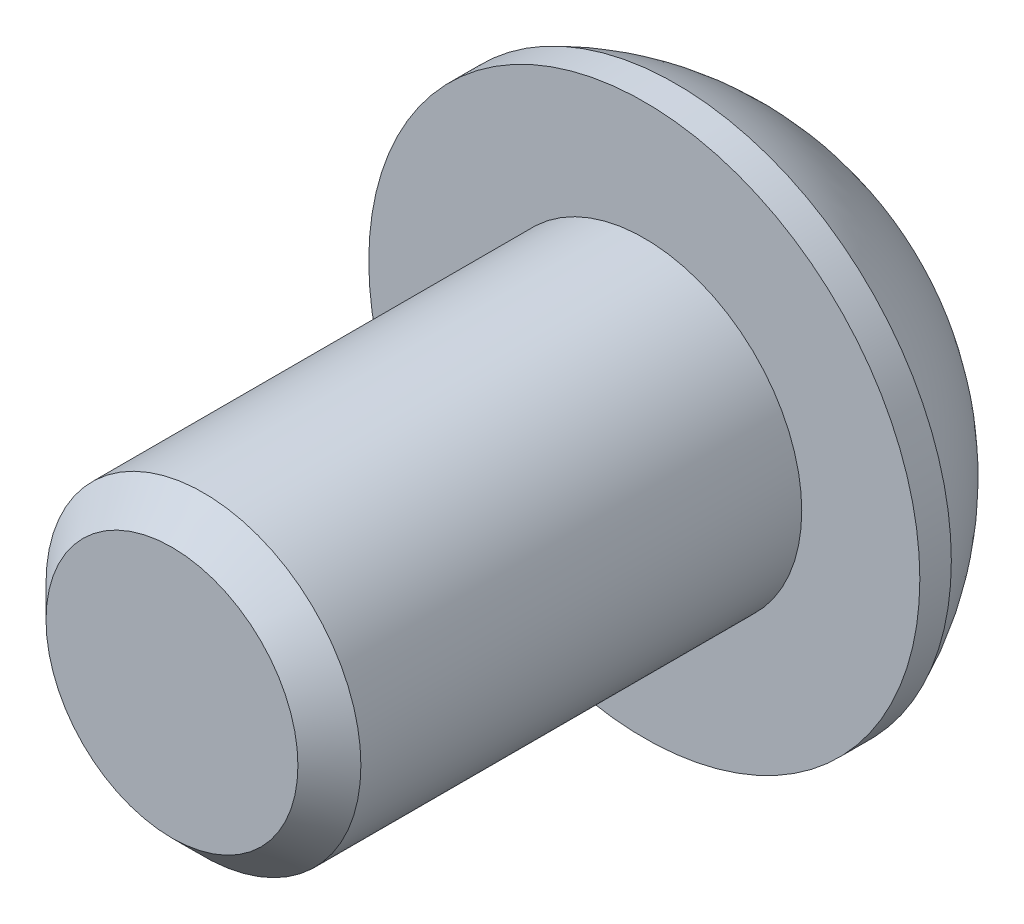
ISO-10303-21;
HEADER;
FILE_DESCRIPTION(('STEP AP214'),'2;1');
FILE_NAME('part.step','',(''),(''),'','','');
FILE_SCHEMA(('AUTOMOTIVE_DESIGN { 1 0 10303 214 1 1 1 1 }'));
ENDSEC;
DATA;
#1=APPLICATION_CONTEXT('core data for automotive mechanical design processes');
#2=APPLICATION_PROTOCOL_DEFINITION('international standard','automotive_design',2000,#1);
#3=PRODUCT_CONTEXT('',#1,'mechanical');
#4=PRODUCT('Part','Part','',(#3));
#5=PRODUCT_RELATED_PRODUCT_CATEGORY('part','',(#4));
#6=PRODUCT_DEFINITION_FORMATION('','',#4);
#7=PRODUCT_DEFINITION_CONTEXT('part definition',#1,'design');
#8=PRODUCT_DEFINITION('design','',#6,#7);
#9=PRODUCT_DEFINITION_SHAPE('','',#8);
#10=(LENGTH_UNIT() NAMED_UNIT(*) SI_UNIT(.MILLI.,.METRE.));
#11=(NAMED_UNIT(*) PLANE_ANGLE_UNIT() SI_UNIT($,.RADIAN.));
#12=(NAMED_UNIT(*) SI_UNIT($,.STERADIAN.) SOLID_ANGLE_UNIT());
#13=UNCERTAINTY_MEASURE_WITH_UNIT(LENGTH_MEASURE(1.E-05),#10,'distance_accuracy_value','');
#14=(GEOMETRIC_REPRESENTATION_CONTEXT(3) GLOBAL_UNCERTAINTY_ASSIGNED_CONTEXT((#13)) GLOBAL_UNIT_ASSIGNED_CONTEXT((#10,
#11,#12)) REPRESENTATION_CONTEXT('',''));
#15=CARTESIAN_POINT('',(0.,0.,0.));
#16=DIRECTION('',(0.,0.,1.));
#17=DIRECTION('',(1.,0.,0.));
#18=AXIS2_PLACEMENT_3D('',#15,#16,#17);
#19=CARTESIAN_POINT('',(0.,0.,-2.1));
#20=DIRECTION('',(0.,0.,1.));
#21=DIRECTION('',(1.,0.,0.));
#22=AXIS2_PLACEMENT_3D('',#19,#20,#21);
#23=PLANE('',#22);
#24=DIRECTION('',(0.866025403784439,0.499999999999999,0.));
#25=VECTOR('',#24,1.);
#26=CARTESIAN_POINT('',(2.5,-1.44337567297406,-2.1));
#27=LINE('',#26,#25);
#28=CARTESIAN_POINT('',(2.5,-1.44337567297406,-2.1));
#29=VERTEX_POINT('',#28);
#30=CARTESIAN_POINT('',(0.,-2.88675134594813,-2.1));
#31=VERTEX_POINT('',#30);
#32=EDGE_CURVE('E73',#29,#31,#27,.F.);
#33=ORIENTED_EDGE('',*,*,#32,.T.);
#34=DIRECTION('',(0.866025403784438,-0.5,0.));
#35=VECTOR('',#34,1.);
#36=CARTESIAN_POINT('',(0.,-2.88675134594813,-2.1));
#37=LINE('',#36,#35);
#38=CARTESIAN_POINT('',(-2.5,-1.44337567297406,-2.1));
#39=VERTEX_POINT('',#38);
#40=EDGE_CURVE('E145',#31,#39,#37,.F.);
#41=ORIENTED_EDGE('',*,*,#40,.T.);
#42=DIRECTION('',(0.,1.,0.));
#43=VECTOR('',#42,1.);
#44=CARTESIAN_POINT('',(-2.5,-1.44337567297406,-2.1));
#45=LINE('',#44,#43);
#46=CARTESIAN_POINT('',(-2.5,1.44337567297407,-2.1));
#47=VERTEX_POINT('',#46);
#48=EDGE_CURVE('E153',#39,#47,#45,.T.);
#49=ORIENTED_EDGE('',*,*,#48,.T.);
#50=DIRECTION('',(-0.866025403784439,-0.5,0.));
#51=VECTOR('',#50,1.);
#52=CARTESIAN_POINT('',(-2.5,1.44337567297407,-2.1));
#53=LINE('',#52,#51);
#54=CARTESIAN_POINT('',(0.,2.88675134594813,-2.1));
#55=VERTEX_POINT('',#54);
#56=EDGE_CURVE('E158',#47,#55,#53,.F.);
#57=ORIENTED_EDGE('',*,*,#56,.T.);
#58=DIRECTION('',(-0.866025403784439,0.5,0.));
#59=VECTOR('',#58,1.);
#60=CARTESIAN_POINT('',(0.,2.88675134594813,-2.1));
#61=LINE('',#60,#59);
#62=CARTESIAN_POINT('',(2.5,1.44337567297406,-2.1));
#63=VERTEX_POINT('',#62);
#64=EDGE_CURVE('E69',#55,#63,#61,.F.);
#65=ORIENTED_EDGE('',*,*,#64,.T.);
#66=DIRECTION('',(0.,1.,0.));
#67=VECTOR('',#66,1.);
#68=CARTESIAN_POINT('',(2.5,1.44337567297406,-2.1));
#69=LINE('',#68,#67);
#70=EDGE_CURVE('E71',#63,#29,#69,.F.);
#71=ORIENTED_EDGE('',*,*,#70,.T.);
#72=EDGE_LOOP('',(#33,#41,#49,#57,#65,#71));
#73=FACE_BOUND('',#72,.T.);
#74=ADVANCED_FACE('F17',(#73),#23,.F.);
#75=CARTESIAN_POINT('',(2.5,-1.44337567297406,-4.4));
#76=DIRECTION('',(0.499999999999999,-0.866025403784439,0.));
#77=DIRECTION('',(0.866025403784439,0.499999999999999,0.));
#78=AXIS2_PLACEMENT_3D('',#75,#76,#77);
#79=PLANE('',#78);
#80=ORIENTED_EDGE('',*,*,#32,.F.);
#81=DIRECTION('',(0.,0.,-1.));
#82=VECTOR('',#81,1.);
#83=CARTESIAN_POINT('',(2.5,-1.44337567297406,-4.4));
#84=LINE('',#83,#82);
#85=CARTESIAN_POINT('',(2.5,-1.44337567297406,-4.4));
#86=VERTEX_POINT('',#85);
#87=EDGE_CURVE('E79',#29,#86,#84,.T.);
#88=ORIENTED_EDGE('',*,*,#87,.T.);
#89=DIRECTION('',(0.866025403784438,0.500000000000001,0.));
#90=VECTOR('',#89,1.);
#91=CARTESIAN_POINT('',(0.,-2.88675134594813,-4.4));
#92=LINE('',#91,#90);
#93=CARTESIAN_POINT('',(0.,-2.88675134594813,-4.4));
#94=VERTEX_POINT('',#93);
#95=EDGE_CURVE('E140',#94,#86,#92,.T.);
#96=ORIENTED_EDGE('',*,*,#95,.F.);
#97=DIRECTION('',(0.,0.,1.));
#98=VECTOR('',#97,1.);
#99=CARTESIAN_POINT('',(0.,-2.88675134594813,-4.4));
#100=LINE('',#99,#98);
#101=EDGE_CURVE('E85',#94,#31,#100,.T.);
#102=ORIENTED_EDGE('',*,*,#101,.T.);
#103=EDGE_LOOP('',(#80,#88,#96,#102));
#104=FACE_BOUND('',#103,.T.);
#105=ADVANCED_FACE('F82',(#104),#79,.F.);
#106=CARTESIAN_POINT('',(2.5,1.44337567297406,-4.4));
#107=DIRECTION('',(1.,0.,0.));
#108=DIRECTION('',(0.,0.,-1.));
#109=AXIS2_PLACEMENT_3D('',#106,#107,#108);
#110=PLANE('',#109);
#111=ORIENTED_EDGE('',*,*,#70,.F.);
#112=DIRECTION('',(0.,0.,1.));
#113=VECTOR('',#112,1.);
#114=CARTESIAN_POINT('',(2.5,1.44337567297406,-4.4));
#115=LINE('',#114,#113);
#116=CARTESIAN_POINT('',(2.5,1.44337567297406,-4.4));
#117=VERTEX_POINT('',#116);
#118=EDGE_CURVE('E98',#63,#117,#115,.F.);
#119=ORIENTED_EDGE('',*,*,#118,.T.);
#120=DIRECTION('',(0.,1.,0.));
#121=VECTOR('',#120,1.);
#122=CARTESIAN_POINT('',(2.5,-1.75,-4.4));
#123=LINE('',#122,#121);
#124=EDGE_CURVE('E91',#86,#117,#123,.T.);
#125=ORIENTED_EDGE('',*,*,#124,.F.);
#126=ORIENTED_EDGE('',*,*,#87,.F.);
#127=EDGE_LOOP('',(#111,#119,#125,#126));
#128=FACE_BOUND('',#127,.T.);
#129=ADVANCED_FACE('F89',(#128),#110,.F.);
#130=CARTESIAN_POINT('',(0.,2.88675134594813,-4.4));
#131=DIRECTION('',(0.5,0.866025403784439,0.));
#132=DIRECTION('',(-0.866025403784439,0.5,0.));
#133=AXIS2_PLACEMENT_3D('',#130,#131,#132);
#134=PLANE('',#133);
#135=ORIENTED_EDGE('',*,*,#64,.F.);
#136=DIRECTION('',(0.,0.,1.));
#137=VECTOR('',#136,1.);
#138=CARTESIAN_POINT('',(0.,2.88675134594813,-4.4));
#139=LINE('',#138,#137);
#140=CARTESIAN_POINT('',(0.,2.88675134594813,-4.4));
#141=VERTEX_POINT('',#140);
#142=EDGE_CURVE('E155',#55,#141,#139,.F.);
#143=ORIENTED_EDGE('',*,*,#142,.T.);
#144=DIRECTION('',(-0.866025403784438,0.500000000000002,0.));
#145=VECTOR('',#144,1.);
#146=CARTESIAN_POINT('',(2.5,1.44337567297406,-4.4));
#147=LINE('',#146,#145);
#148=EDGE_CURVE('E134',#117,#141,#147,.T.);
#149=ORIENTED_EDGE('',*,*,#148,.F.);
#150=ORIENTED_EDGE('',*,*,#118,.F.);
#151=EDGE_LOOP('',(#135,#143,#149,#150));
#152=FACE_BOUND('',#151,.T.);
#153=ADVANCED_FACE('F162',(#152),#134,.F.);
#154=CARTESIAN_POINT('',(-2.5,1.44337567297407,-4.4));
#155=DIRECTION('',(-0.5,0.866025403784439,0.));
#156=DIRECTION('',(-0.866025403784439,-0.5,0.));
#157=AXIS2_PLACEMENT_3D('',#154,#155,#156);
#158=PLANE('',#157);
#159=ORIENTED_EDGE('',*,*,#56,.F.);
#160=DIRECTION('',(0.,0.,1.));
#161=VECTOR('',#160,1.);
#162=CARTESIAN_POINT('',(-2.5,1.44337567297407,-4.4));
#163=LINE('',#162,#161);
#164=CARTESIAN_POINT('',(-2.5,1.44337567297407,-4.4));
#165=VERTEX_POINT('',#164);
#166=EDGE_CURVE('E150',#47,#165,#163,.F.);
#167=ORIENTED_EDGE('',*,*,#166,.T.);
#168=DIRECTION('',(-0.866025403784438,-0.500000000000001,0.));
#169=VECTOR('',#168,1.);
#170=CARTESIAN_POINT('',(0.,2.88675134594813,-4.4));
#171=LINE('',#170,#169);
#172=EDGE_CURVE('E130',#141,#165,#171,.T.);
#173=ORIENTED_EDGE('',*,*,#172,.F.);
#174=ORIENTED_EDGE('',*,*,#142,.F.);
#175=EDGE_LOOP('',(#159,#167,#173,#174));
#176=FACE_BOUND('',#175,.T.);
#177=ADVANCED_FACE('F174',(#176),#158,.F.);
#178=CARTESIAN_POINT('',(-2.5,-1.44337567297406,-4.4));
#179=DIRECTION('',(-1.,0.,0.));
#180=DIRECTION('',(0.,0.,1.));
#181=AXIS2_PLACEMENT_3D('',#178,#179,#180);
#182=PLANE('',#181);
#183=ORIENTED_EDGE('',*,*,#48,.F.);
#184=DIRECTION('',(0.,0.,1.));
#185=VECTOR('',#184,1.);
#186=CARTESIAN_POINT('',(-2.5,-1.44337567297406,-4.4));
#187=LINE('',#186,#185);
#188=CARTESIAN_POINT('',(-2.5,-1.44337567297406,-4.4));
#189=VERTEX_POINT('',#188);
#190=EDGE_CURVE('E36',#39,#189,#187,.F.);
#191=ORIENTED_EDGE('',*,*,#190,.T.);
#192=DIRECTION('',(0.,1.,0.));
#193=VECTOR('',#192,1.);
#194=CARTESIAN_POINT('',(-2.5,-1.75,-4.4));
#195=LINE('',#194,#193);
#196=EDGE_CURVE('E126',#165,#189,#195,.F.);
#197=ORIENTED_EDGE('',*,*,#196,.F.);
#198=ORIENTED_EDGE('',*,*,#166,.F.);
#199=EDGE_LOOP('',(#183,#191,#197,#198));
#200=FACE_BOUND('',#199,.T.);
#201=ADVANCED_FACE('F172',(#200),#182,.F.);
#202=CARTESIAN_POINT('',(0.,-2.88675134594813,-4.4));
#203=DIRECTION('',(-0.5,-0.866025403784438,0.));
#204=DIRECTION('',(0.866025403784438,-0.5,0.));
#205=AXIS2_PLACEMENT_3D('',#202,#203,#204);
#206=PLANE('',#205);
#207=ORIENTED_EDGE('',*,*,#40,.F.);
#208=ORIENTED_EDGE('',*,*,#101,.F.);
#209=DIRECTION('',(0.866025403784438,-0.500000000000002,0.));
#210=VECTOR('',#209,1.);
#211=CARTESIAN_POINT('',(-2.5,-1.44337567297406,-4.4));
#212=LINE('',#211,#210);
#213=EDGE_CURVE('E120',#189,#94,#212,.T.);
#214=ORIENTED_EDGE('',*,*,#213,.F.);
#215=ORIENTED_EDGE('',*,*,#190,.F.);
#216=EDGE_LOOP('',(#207,#208,#214,#215));
#217=FACE_BOUND('',#216,.T.);
#218=ADVANCED_FACE('F169',(#217),#206,.F.);
#219=CARTESIAN_POINT('',(0.,-1.75,-4.4));
#220=DIRECTION('',(0.,0.,-1.));
#221=DIRECTION('',(-1.,0.,0.));
#222=AXIS2_PLACEMENT_3D('',#219,#220,#221);
#223=PLANE('',#222);
#224=ORIENTED_EDGE('',*,*,#196,.T.);
#225=ORIENTED_EDGE('',*,*,#213,.T.);
#226=ORIENTED_EDGE('',*,*,#95,.T.);
#227=ORIENTED_EDGE('',*,*,#124,.T.);
#228=ORIENTED_EDGE('',*,*,#148,.T.);
#229=ORIENTED_EDGE('',*,*,#172,.T.);
#230=EDGE_LOOP('',(#224,#225,#226,#227,#228,#229));
#231=FACE_BOUND('',#230,.T.);
#232=CARTESIAN_POINT('',(0.,0.,-4.4));
#233=DIRECTION('',(0.,0.,-1.));
#234=DIRECTION('',(-1.,0.,0.));
#235=AXIS2_PLACEMENT_3D('',#232,#233,#234);
#236=CIRCLE('',#235,3.5);
#237=CARTESIAN_POINT('',(-3.5,0.,-4.4));
#238=VERTEX_POINT('',#237);
#239=EDGE_CURVE('E20',#238,#238,#236,.F.);
#240=ORIENTED_EDGE('',*,*,#239,.F.);
#241=EDGE_LOOP('',(#240));
#242=FACE_BOUND('',#241,.T.);
#243=ADVANCED_FACE('F166',(#231,#242),#223,.T.);
#244=CARTESIAN_POINT('',(0.,0.,2.17249999999999));
#245=DIRECTION('',(0.,0.,-1.));
#246=DIRECTION('',(0.,-1.,0.));
#247=AXIS2_PLACEMENT_3D('',#244,#245,#246);
#248=DEGENERATE_TOROIDAL_SURFACE('',#247,0.341142857142867,7.29219683627502,.T.);
#249=CARTESIAN_POINT('',(0.,0.,-0.800000000000004));
#250=DIRECTION('',(0.,0.,-1.));
#251=DIRECTION('',(-1.,0.,0.));
#252=AXIS2_PLACEMENT_3D('',#249,#250,#251);
#253=CIRCLE('',#252,7.);
#254=CARTESIAN_POINT('',(-7.,0.,-0.800000000000004));
#255=VERTEX_POINT('',#254);
#256=EDGE_CURVE('E108',#255,#255,#253,.F.);
#257=ORIENTED_EDGE('',*,*,#256,.F.);
#258=EDGE_LOOP('',(#257));
#259=FACE_BOUND('',#258,.T.);
#260=ORIENTED_EDGE('',*,*,#239,.T.);
#261=EDGE_LOOP('',(#260));
#262=FACE_BOUND('',#261,.T.);
#263=ADVANCED_FACE('F205',(#259,#262),#248,.T.);
#264=CARTESIAN_POINT('',(0.,0.,12.));
#265=DIRECTION('',(0.,0.,1.));
#266=DIRECTION('',(1.,0.,0.));
#267=AXIS2_PLACEMENT_3D('',#264,#265,#266);
#268=PLANE('',#267);
#269=CARTESIAN_POINT('',(0.,0.,12.0000000000005));
#270=DIRECTION('',(0.,0.,-1.));
#271=DIRECTION('',(-1.,0.,0.));
#272=AXIS2_PLACEMENT_3D('',#269,#270,#271);
#273=CIRCLE('',#272,3.1999999999357);
#274=CARTESIAN_POINT('',(-3.1999999999357,0.,12.0000000000005));
#275=VERTEX_POINT('',#274);
#276=EDGE_CURVE('E105',#275,#275,#273,.T.);
#277=ORIENTED_EDGE('',*,*,#276,.F.);
#278=EDGE_LOOP('',(#277));
#279=FACE_BOUND('',#278,.T.);
#280=ADVANCED_FACE('F201',(#279),#268,.T.);
#281=CARTESIAN_POINT('',(0.,0.,-0.4));
#282=DIRECTION('',(0.,0.,-1.));
#283=DIRECTION('',(-1.,0.,0.));
#284=AXIS2_PLACEMENT_3D('',#281,#282,#283);
#285=CYLINDRICAL_SURFACE('',#284,7.);
#286=CARTESIAN_POINT('',(0.,0.,0.));
#287=DIRECTION('',(0.,0.,-1.));
#288=DIRECTION('',(-1.,0.,0.));
#289=AXIS2_PLACEMENT_3D('',#286,#287,#288);
#290=CIRCLE('',#289,7.);
#291=CARTESIAN_POINT('',(-7.,0.,0.));
#292=VERTEX_POINT('',#291);
#293=EDGE_CURVE('E102',#292,#292,#290,.T.);
#294=ORIENTED_EDGE('',*,*,#293,.T.);
#295=EDGE_LOOP('',(#294));
#296=FACE_BOUND('',#295,.T.);
#297=ORIENTED_EDGE('',*,*,#256,.T.);
#298=EDGE_LOOP('',(#297));
#299=FACE_BOUND('',#298,.T.);
#300=ADVANCED_FACE('F197',(#296,#299),#285,.T.);
#301=CARTESIAN_POINT('',(0.,0.,11.2000000000307));
#302=DIRECTION('',(0.,0.,-1.));
#303=DIRECTION('',(-1.,0.,0.));
#304=AXIS2_PLACEMENT_3D('',#301,#302,#303);
#305=CONICAL_SURFACE('',#304,3.99999999990541,0.785398163397448);
#306=CARTESIAN_POINT('',(0.,0.,11.2));
#307=DIRECTION('',(0.,0.,1.));
#308=DIRECTION('',(1.,0.,0.));
#309=AXIS2_PLACEMENT_3D('',#306,#307,#308);
#310=CIRCLE('',#309,4.);
#311=CARTESIAN_POINT('',(4.,0.,11.2));
#312=VERTEX_POINT('',#311);
#313=EDGE_CURVE('E27',#312,#312,#310,.F.);
#314=ORIENTED_EDGE('',*,*,#313,.F.);
#315=EDGE_LOOP('',(#314));
#316=FACE_BOUND('',#315,.T.);
#317=ORIENTED_EDGE('',*,*,#276,.T.);
#318=EDGE_LOOP('',(#317));
#319=FACE_BOUND('',#318,.T.);
#320=ADVANCED_FACE('F190',(#316,#319),#305,.T.);
#321=CARTESIAN_POINT('',(0.,-3.5,0.));
#322=DIRECTION('',(0.,0.,-1.));
#323=DIRECTION('',(-1.,0.,0.));
#324=AXIS2_PLACEMENT_3D('',#321,#322,#323);
#325=PLANE('',#324);
#326=CARTESIAN_POINT('',(0.,0.,0.));
#327=DIRECTION('',(0.,0.,1.));
#328=DIRECTION('',(1.,0.,0.));
#329=AXIS2_PLACEMENT_3D('',#326,#327,#328);
#330=CIRCLE('',#329,4.);
#331=CARTESIAN_POINT('',(4.,0.,0.));
#332=VERTEX_POINT('',#331);
#333=EDGE_CURVE('E11',#332,#332,#330,.T.);
#334=ORIENTED_EDGE('',*,*,#333,.F.);
#335=EDGE_LOOP('',(#334));
#336=FACE_BOUND('',#335,.T.);
#337=ORIENTED_EDGE('',*,*,#293,.F.);
#338=EDGE_LOOP('',(#337));
#339=FACE_BOUND('',#338,.T.);
#340=ADVANCED_FACE('F185',(#336,#339),#325,.F.);
#341=CARTESIAN_POINT('',(0.,0.,0.));
#342=DIRECTION('',(0.,0.,1.));
#343=DIRECTION('',(1.,0.,0.));
#344=AXIS2_PLACEMENT_3D('',#341,#342,#343);
#345=CYLINDRICAL_SURFACE('',#344,4.);
#346=ORIENTED_EDGE('',*,*,#333,.T.);
#347=EDGE_LOOP('',(#346));
#348=FACE_BOUND('',#347,.T.);
#349=ORIENTED_EDGE('',*,*,#313,.T.);
#350=EDGE_LOOP('',(#349));
#351=FACE_BOUND('',#350,.T.);
#352=ADVANCED_FACE('F183',(#348,#351),#345,.T.);
#353=CLOSED_SHELL('',(#74,#105,#129,#153,#177,#201,#218,#243,#263,#280,#300,#320,#340,#352));
#354=MANIFOLD_SOLID_BREP('B1',#353);
#355=ADVANCED_BREP_SHAPE_REPRESENTATION('',(#18,#354),#14);
#356=SHAPE_DEFINITION_REPRESENTATION(#9,#355);
ENDSEC;
END-ISO-10303-21;
